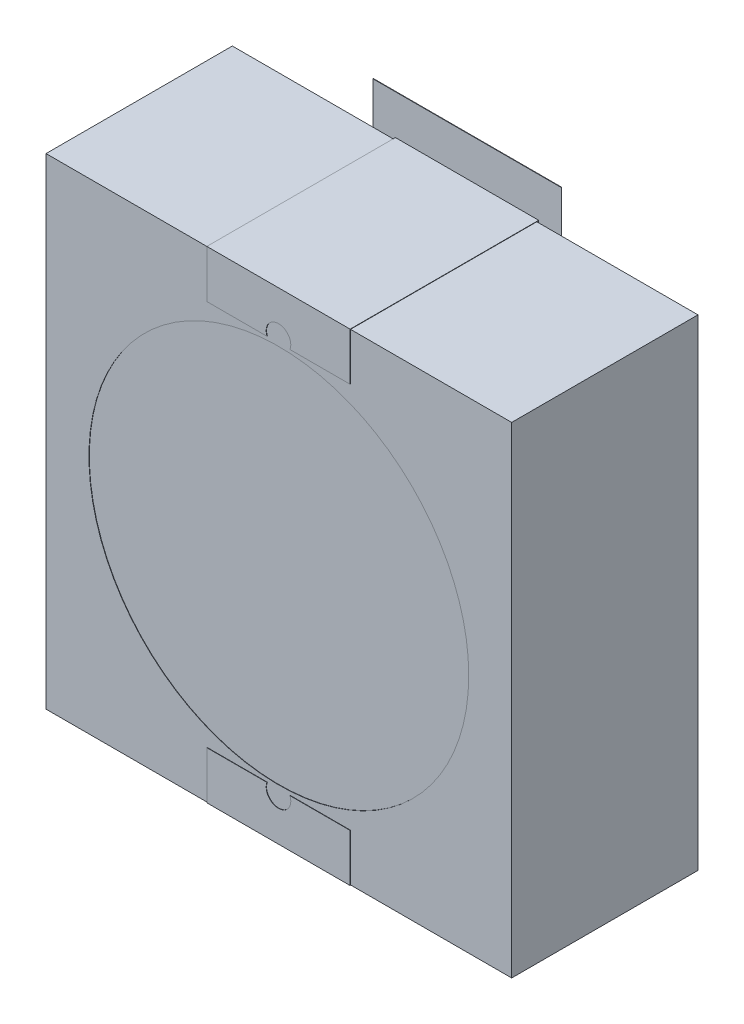
ISO-10303-21;
HEADER;
FILE_DESCRIPTION(('STEP AP214'),'2;1');
FILE_NAME('part.step','',(''),(''),'','','');
FILE_SCHEMA(('AUTOMOTIVE_DESIGN { 1 0 10303 214 1 1 1 1 }'));
ENDSEC;
DATA;
#1=APPLICATION_CONTEXT('core data for automotive mechanical design processes');
#2=APPLICATION_PROTOCOL_DEFINITION('international standard','automotive_design',2000,#1);
#3=PRODUCT_CONTEXT('',#1,'mechanical');
#4=PRODUCT('Part','Part','',(#3));
#5=PRODUCT_RELATED_PRODUCT_CATEGORY('part','',(#4));
#6=PRODUCT_DEFINITION_FORMATION('','',#4);
#7=PRODUCT_DEFINITION_CONTEXT('part definition',#1,'design');
#8=PRODUCT_DEFINITION('design','',#6,#7);
#9=PRODUCT_DEFINITION_SHAPE('','',#8);
#10=(LENGTH_UNIT() NAMED_UNIT(*) SI_UNIT(.MILLI.,.METRE.));
#11=(NAMED_UNIT(*) PLANE_ANGLE_UNIT() SI_UNIT($,.RADIAN.));
#12=(NAMED_UNIT(*) SI_UNIT($,.STERADIAN.) SOLID_ANGLE_UNIT());
#13=UNCERTAINTY_MEASURE_WITH_UNIT(LENGTH_MEASURE(1.E-05),#10,'distance_accuracy_value','');
#14=(GEOMETRIC_REPRESENTATION_CONTEXT(3) GLOBAL_UNCERTAINTY_ASSIGNED_CONTEXT((#13)) GLOBAL_UNIT_ASSIGNED_CONTEXT((#10,
#11,#12)) REPRESENTATION_CONTEXT('',''));
#15=CARTESIAN_POINT('',(0.,0.,0.));
#16=DIRECTION('',(0.,0.,1.));
#17=DIRECTION('',(1.,0.,0.));
#18=AXIS2_PLACEMENT_3D('',#15,#16,#17);
#19=CARTESIAN_POINT('',(-1.524,4.10972,0.0762));
#20=DIRECTION('',(0.,0.,-1.));
#21=DIRECTION('',(-1.,0.,0.));
#22=AXIS2_PLACEMENT_3D('',#19,#20,#21);
#23=PLANE('',#22);
#24=DIRECTION('',(1.,0.,0.));
#25=VECTOR('',#24,1.);
#26=CARTESIAN_POINT('',(2.0049998,-1.6500094,0.0762));
#27=LINE('',#26,#25);
#28=CARTESIAN_POINT('',(2.0049998,-1.6500094,0.0762));
#29=VERTEX_POINT('',#28);
#30=CARTESIAN_POINT('',(-2.0049998,-1.6500094,0.0762));
#31=VERTEX_POINT('',#30);
#32=EDGE_CURVE('E252',#29,#31,#27,.F.);
#33=ORIENTED_EDGE('',*,*,#32,.F.);
#34=DIRECTION('',(0.,1.,0.));
#35=VECTOR('',#34,1.);
#36=CARTESIAN_POINT('',(2.0049998,-5.9699906,0.0762));
#37=LINE('',#36,#35);
#38=CARTESIAN_POINT('',(2.0049998,-5.9699906,0.0762));
#39=VERTEX_POINT('',#38);
#40=EDGE_CURVE('E344',#39,#29,#37,.T.);
#41=ORIENTED_EDGE('',*,*,#40,.F.);
#42=DIRECTION('',(1.,0.,0.));
#43=VECTOR('',#42,1.);
#44=CARTESIAN_POINT('',(-2.0049998,-5.9699906,0.0762));
#45=LINE('',#44,#43);
#46=CARTESIAN_POINT('',(-2.0049998,-5.9699906,0.0762));
#47=VERTEX_POINT('',#46);
#48=EDGE_CURVE('E352',#47,#39,#45,.T.);
#49=ORIENTED_EDGE('',*,*,#48,.F.);
#50=DIRECTION('',(0.,1.,0.));
#51=VECTOR('',#50,1.);
#52=CARTESIAN_POINT('',(-2.0049998,-1.6500094,0.0762));
#53=LINE('',#52,#51);
#54=EDGE_CURVE('E357',#31,#47,#53,.F.);
#55=ORIENTED_EDGE('',*,*,#54,.F.);
#56=EDGE_LOOP('',(#33,#41,#49,#55));
#57=FACE_BOUND('',#56,.T.);
#58=ADVANCED_FACE('F16',(#57),#23,.T.);
#59=CARTESIAN_POINT('',(-1.524,4.10972,0.0762));
#60=DIRECTION('',(0.,0.,-1.));
#61=DIRECTION('',(-1.,0.,0.));
#62=AXIS2_PLACEMENT_3D('',#59,#60,#61);
#63=PLANE('',#62);
#64=DIRECTION('',(1.,0.,0.));
#65=VECTOR('',#64,1.);
#66=CARTESIAN_POINT('',(2.0049998,5.9699906,0.0762));
#67=LINE('',#66,#65);
#68=CARTESIAN_POINT('',(2.0049998,5.9699906,0.0762));
#69=VERTEX_POINT('',#68);
#70=CARTESIAN_POINT('',(-2.0049998,5.9699906,0.0762));
#71=VERTEX_POINT('',#70);
#72=EDGE_CURVE('E340',#69,#71,#67,.F.);
#73=ORIENTED_EDGE('',*,*,#72,.F.);
#74=DIRECTION('',(0.,1.,0.));
#75=VECTOR('',#74,1.);
#76=CARTESIAN_POINT('',(2.0049998,1.6500094,0.0762));
#77=LINE('',#76,#75);
#78=CARTESIAN_POINT('',(2.0049998,1.6500094,0.0762));
#79=VERTEX_POINT('',#78);
#80=EDGE_CURVE('E294',#79,#69,#77,.T.);
#81=ORIENTED_EDGE('',*,*,#80,.F.);
#82=DIRECTION('',(1.,0.,0.));
#83=VECTOR('',#82,1.);
#84=CARTESIAN_POINT('',(-2.0049998,1.6500094,0.0762));
#85=LINE('',#84,#83);
#86=CARTESIAN_POINT('',(-2.0049998,1.6500094,0.0762));
#87=VERTEX_POINT('',#86);
#88=EDGE_CURVE('E433',#87,#79,#85,.T.);
#89=ORIENTED_EDGE('',*,*,#88,.F.);
#90=DIRECTION('',(0.,1.,0.));
#91=VECTOR('',#90,1.);
#92=CARTESIAN_POINT('',(-2.0049998,5.9699906,0.0762));
#93=LINE('',#92,#91);
#94=EDGE_CURVE('E438',#71,#87,#93,.F.);
#95=ORIENTED_EDGE('',*,*,#94,.F.);
#96=EDGE_LOOP('',(#73,#81,#89,#95));
#97=FACE_BOUND('',#96,.T.);
#98=ADVANCED_FACE('F451',(#97),#63,.T.);
#99=CARTESIAN_POINT('',(-1.524,5.12572,4.09702));
#100=DIRECTION('',(0.,0.,1.));
#101=DIRECTION('',(1.,0.,0.));
#102=AXIS2_PLACEMENT_3D('',#99,#100,#101);
#103=PLANE('',#102);
#104=DIRECTION('',(1.,0.,0.));
#105=VECTOR('',#104,1.);
#106=CARTESIAN_POINT('',(-1.524,4.10972,4.09702));
#107=LINE('',#106,#105);
#108=CARTESIAN_POINT('',(-1.524,4.10972,4.09702));
#109=VERTEX_POINT('',#108);
#110=CARTESIAN_POINT('',(-0.244157293562977,4.10972,4.09702));
#111=VERTEX_POINT('',#110);
#112=EDGE_CURVE('E221',#109,#111,#107,.T.);
#113=ORIENTED_EDGE('',*,*,#112,.T.);
#114=CARTESIAN_POINT('',(0.,4.2037,4.09702));
#115=DIRECTION('',(0.,0.,1.));
#116=DIRECTION('',(1.,0.,0.));
#117=AXIS2_PLACEMENT_3D('',#114,#115,#116);
#118=CIRCLE('',#117,0.26162);
#119=CARTESIAN_POINT('',(0.244157293562981,4.10972,4.09702));
#120=VERTEX_POINT('',#119);
#121=EDGE_CURVE('E19',#111,#120,#118,.F.);
#122=ORIENTED_EDGE('',*,*,#121,.T.);
#123=DIRECTION('',(1.,0.,0.));
#124=VECTOR('',#123,1.);
#125=CARTESIAN_POINT('',(-1.524,4.10972,4.09702));
#126=LINE('',#125,#124);
#127=CARTESIAN_POINT('',(1.524,4.10972,4.09702));
#128=VERTEX_POINT('',#127);
#129=EDGE_CURVE('E264',#120,#128,#126,.T.);
#130=ORIENTED_EDGE('',*,*,#129,.T.);
#131=DIRECTION('',(0.,1.,0.));
#132=VECTOR('',#131,1.);
#133=CARTESIAN_POINT('',(1.524,5.12572,4.09702));
#134=LINE('',#133,#132);
#135=CARTESIAN_POINT('',(1.524,5.12572,4.09702));
#136=VERTEX_POINT('',#135);
#137=EDGE_CURVE('E266',#128,#136,#134,.T.);
#138=ORIENTED_EDGE('',*,*,#137,.T.);
#139=DIRECTION('',(1.,0.,0.));
#140=VECTOR('',#139,1.);
#141=CARTESIAN_POINT('',(-1.524,5.12572,4.09702));
#142=LINE('',#141,#140);
#143=CARTESIAN_POINT('',(-1.524,5.12572,4.09702));
#144=VERTEX_POINT('',#143);
#145=EDGE_CURVE('E291',#144,#136,#142,.T.);
#146=ORIENTED_EDGE('',*,*,#145,.F.);
#147=DIRECTION('',(0.,1.,0.));
#148=VECTOR('',#147,1.);
#149=CARTESIAN_POINT('',(-1.524,5.12572,4.09702));
#150=LINE('',#149,#148);
#151=EDGE_CURVE('E227',#144,#109,#150,.F.);
#152=ORIENTED_EDGE('',*,*,#151,.T.);
#153=EDGE_LOOP('',(#113,#122,#130,#138,#146,#152));
#154=FACE_BOUND('',#153,.T.);
#155=ADVANCED_FACE('F223',(#154),#103,.T.);
#156=CARTESIAN_POINT('',(0.,0.,4.08178));
#157=DIRECTION('',(0.,0.,1.));
#158=DIRECTION('',(1.,0.,0.));
#159=AXIS2_PLACEMENT_3D('',#156,#157,#158);
#160=PLANE('',#159);
#161=CARTESIAN_POINT('',(0.,0.,4.08178));
#162=DIRECTION('',(0.,0.,1.));
#163=DIRECTION('',(1.,0.,0.));
#164=AXIS2_PLACEMENT_3D('',#161,#162,#163);
#165=CIRCLE('',#164,4.0397019473008);
#166=CARTESIAN_POINT('',(4.0397019473008,0.,4.08178));
#167=VERTEX_POINT('',#166);
#168=EDGE_CURVE('E324',#167,#167,#165,.T.);
#169=ORIENTED_EDGE('',*,*,#168,.T.);
#170=EDGE_LOOP('',(#169));
#171=FACE_BOUND('',#170,.T.);
#172=ADVANCED_FACE('F733',(#171),#160,.T.);
#173=CARTESIAN_POINT('',(-1.524,-4.10972,4.09702));
#174=DIRECTION('',(0.,0.,1.));
#175=DIRECTION('',(1.,0.,0.));
#176=AXIS2_PLACEMENT_3D('',#173,#174,#175);
#177=PLANE('',#176);
#178=DIRECTION('',(1.,0.,0.));
#179=VECTOR('',#178,1.);
#180=CARTESIAN_POINT('',(-1.524,-4.10972,4.09702));
#181=LINE('',#180,#179);
#182=CARTESIAN_POINT('',(0.244157293562977,-4.10972,4.09702));
#183=VERTEX_POINT('',#182);
#184=CARTESIAN_POINT('',(1.524,-4.10972,4.09702));
#185=VERTEX_POINT('',#184);
#186=EDGE_CURVE('E329',#183,#185,#181,.T.);
#187=ORIENTED_EDGE('',*,*,#186,.F.);
#188=CARTESIAN_POINT('',(0.,-4.2037,4.09702));
#189=DIRECTION('',(0.,0.,1.));
#190=DIRECTION('',(1.,0.,0.));
#191=AXIS2_PLACEMENT_3D('',#188,#189,#190);
#192=CIRCLE('',#191,0.26162);
#193=CARTESIAN_POINT('',(-0.244157293562977,-4.10972,4.09702));
#194=VERTEX_POINT('',#193);
#195=EDGE_CURVE('E239',#183,#194,#192,.F.);
#196=ORIENTED_EDGE('',*,*,#195,.T.);
#197=DIRECTION('',(1.,0.,0.));
#198=VECTOR('',#197,1.);
#199=CARTESIAN_POINT('',(-1.524,-4.10972,4.09702));
#200=LINE('',#199,#198);
#201=CARTESIAN_POINT('',(-1.524,-4.10972,4.09702));
#202=VERTEX_POINT('',#201);
#203=EDGE_CURVE('E326',#202,#194,#200,.T.);
#204=ORIENTED_EDGE('',*,*,#203,.F.);
#205=DIRECTION('',(0.,1.,0.));
#206=VECTOR('',#205,1.);
#207=CARTESIAN_POINT('',(-1.524,-4.10972,4.09702));
#208=LINE('',#207,#206);
#209=CARTESIAN_POINT('',(-1.524,-5.12572,4.09702));
#210=VERTEX_POINT('',#209);
#211=EDGE_CURVE('E245',#202,#210,#208,.F.);
#212=ORIENTED_EDGE('',*,*,#211,.T.);
#213=DIRECTION('',(1.,0.,0.));
#214=VECTOR('',#213,1.);
#215=CARTESIAN_POINT('',(-1.524,-5.12572,4.09702));
#216=LINE('',#215,#214);
#217=CARTESIAN_POINT('',(1.524,-5.12572,4.09702));
#218=VERTEX_POINT('',#217);
#219=EDGE_CURVE('E269',#218,#210,#216,.F.);
#220=ORIENTED_EDGE('',*,*,#219,.F.);
#221=DIRECTION('',(0.,1.,0.));
#222=VECTOR('',#221,1.);
#223=CARTESIAN_POINT('',(1.524,-4.10972,4.09702));
#224=LINE('',#223,#222);
#225=EDGE_CURVE('E246',#218,#185,#224,.T.);
#226=ORIENTED_EDGE('',*,*,#225,.T.);
#227=EDGE_LOOP('',(#187,#196,#204,#212,#220,#226));
#228=FACE_BOUND('',#227,.T.);
#229=ADVANCED_FACE('F681',(#228),#177,.T.);
#230=CARTESIAN_POINT('',(2.0049998,-1.6500094,0.0762));
#231=DIRECTION('',(0.,1.,0.));
#232=DIRECTION('',(0.,0.,1.));
#233=AXIS2_PLACEMENT_3D('',#230,#231,#232);
#234=PLANE('',#233);
#235=DIRECTION('',(0.,0.,-1.));
#236=VECTOR('',#235,1.);
#237=CARTESIAN_POINT('',(2.0049998,-1.6500094,0.0762));
#238=LINE('',#237,#236);
#239=CARTESIAN_POINT('',(2.0049998,-1.6500094,0.08619999999996));
#240=VERTEX_POINT('',#239);
#241=EDGE_CURVE('E350',#29,#240,#238,.F.);
#242=ORIENTED_EDGE('',*,*,#241,.F.);
#243=ORIENTED_EDGE('',*,*,#32,.T.);
#244=DIRECTION('',(0.,0.,1.));
#245=VECTOR('',#244,1.);
#246=CARTESIAN_POINT('',(-2.0049998,-1.6500094,0.0762));
#247=LINE('',#246,#245);
#248=CARTESIAN_POINT('',(-2.0049998,-1.6500094,0.08619999999996));
#249=VERTEX_POINT('',#248);
#250=EDGE_CURVE('E359',#249,#31,#247,.F.);
#251=ORIENTED_EDGE('',*,*,#250,.F.);
#252=DIRECTION('',(1.,0.,0.));
#253=VECTOR('',#252,1.);
#254=CARTESIAN_POINT('',(0.,-1.6500094,0.08619999999996));
#255=LINE('',#254,#253);
#256=EDGE_CURVE('E271',#240,#249,#255,.F.);
#257=ORIENTED_EDGE('',*,*,#256,.F.);
#258=EDGE_LOOP('',(#242,#243,#251,#257));
#259=FACE_BOUND('',#258,.T.);
#260=ADVANCED_FACE('F726',(#259),#234,.T.);
#261=CARTESIAN_POINT('',(-2.0049998,-1.6500094,0.0762));
#262=DIRECTION('',(-1.,0.,0.));
#263=DIRECTION('',(0.,0.,1.));
#264=AXIS2_PLACEMENT_3D('',#261,#262,#263);
#265=PLANE('',#264);
#266=ORIENTED_EDGE('',*,*,#250,.T.);
#267=ORIENTED_EDGE('',*,*,#54,.T.);
#268=DIRECTION('',(0.,0.,-1.));
#269=VECTOR('',#268,1.);
#270=CARTESIAN_POINT('',(-2.0049998,-5.9699906,0.0762));
#271=LINE('',#270,#269);
#272=CARTESIAN_POINT('',(-2.0049998,-5.9699906,0.08619999999996));
#273=VERTEX_POINT('',#272);
#274=EDGE_CURVE('E354',#273,#47,#271,.T.);
#275=ORIENTED_EDGE('',*,*,#274,.F.);
#276=DIRECTION('',(0.,1.,0.));
#277=VECTOR('',#276,1.);
#278=CARTESIAN_POINT('',(-2.0049998,0.,0.08619999999996));
#279=LINE('',#278,#277);
#280=EDGE_CURVE('E485',#249,#273,#279,.F.);
#281=ORIENTED_EDGE('',*,*,#280,.F.);
#282=EDGE_LOOP('',(#266,#267,#275,#281));
#283=FACE_BOUND('',#282,.T.);
#284=ADVANCED_FACE('F722',(#283),#265,.T.);
#285=CARTESIAN_POINT('',(-2.0049998,-5.9699906,0.0762));
#286=DIRECTION('',(0.,-1.,0.));
#287=DIRECTION('',(0.,0.,-1.));
#288=AXIS2_PLACEMENT_3D('',#285,#286,#287);
#289=PLANE('',#288);
#290=ORIENTED_EDGE('',*,*,#274,.T.);
#291=ORIENTED_EDGE('',*,*,#48,.T.);
#292=DIRECTION('',(0.,0.,-1.));
#293=VECTOR('',#292,1.);
#294=CARTESIAN_POINT('',(2.0049998,-5.9699906,0.0762));
#295=LINE('',#294,#293);
#296=CARTESIAN_POINT('',(2.0049998,-5.9699906,0.08619999999996));
#297=VERTEX_POINT('',#296);
#298=EDGE_CURVE('E347',#297,#39,#295,.T.);
#299=ORIENTED_EDGE('',*,*,#298,.F.);
#300=DIRECTION('',(1.,0.,0.));
#301=VECTOR('',#300,1.);
#302=CARTESIAN_POINT('',(0.,-5.9699906,0.08619999999996));
#303=LINE('',#302,#301);
#304=EDGE_CURVE('E483',#273,#297,#303,.T.);
#305=ORIENTED_EDGE('',*,*,#304,.F.);
#306=EDGE_LOOP('',(#290,#291,#299,#305));
#307=FACE_BOUND('',#306,.T.);
#308=ADVANCED_FACE('F718',(#307),#289,.T.);
#309=CARTESIAN_POINT('',(2.0049998,-5.9699906,0.0762));
#310=DIRECTION('',(1.,0.,0.));
#311=DIRECTION('',(0.,0.,-1.));
#312=AXIS2_PLACEMENT_3D('',#309,#310,#311);
#313=PLANE('',#312);
#314=ORIENTED_EDGE('',*,*,#298,.T.);
#315=ORIENTED_EDGE('',*,*,#40,.T.);
#316=ORIENTED_EDGE('',*,*,#241,.T.);
#317=DIRECTION('',(0.,1.,0.));
#318=VECTOR('',#317,1.);
#319=CARTESIAN_POINT('',(2.0049998,0.,0.08619999999996));
#320=LINE('',#319,#318);
#321=EDGE_CURVE('E480',#297,#240,#320,.T.);
#322=ORIENTED_EDGE('',*,*,#321,.F.);
#323=EDGE_LOOP('',(#314,#315,#316,#322));
#324=FACE_BOUND('',#323,.T.);
#325=ADVANCED_FACE('F715',(#324),#313,.T.);
#326=CARTESIAN_POINT('',(2.0049998,5.9699906,0.0762));
#327=DIRECTION('',(0.,1.,0.));
#328=DIRECTION('',(0.,0.,1.));
#329=AXIS2_PLACEMENT_3D('',#326,#327,#328);
#330=PLANE('',#329);
#331=DIRECTION('',(0.,0.,-1.));
#332=VECTOR('',#331,1.);
#333=CARTESIAN_POINT('',(2.0049998,5.9699906,0.0762));
#334=LINE('',#333,#332);
#335=CARTESIAN_POINT('',(2.0049998,5.9699906,0.08619999999996));
#336=VERTEX_POINT('',#335);
#337=EDGE_CURVE('E431',#69,#336,#334,.F.);
#338=ORIENTED_EDGE('',*,*,#337,.F.);
#339=ORIENTED_EDGE('',*,*,#72,.T.);
#340=DIRECTION('',(0.,0.,1.));
#341=VECTOR('',#340,1.);
#342=CARTESIAN_POINT('',(-2.0049998,5.9699906,0.0762));
#343=LINE('',#342,#341);
#344=CARTESIAN_POINT('',(-2.0049998,5.9699906,0.08619999999996));
#345=VERTEX_POINT('',#344);
#346=EDGE_CURVE('E439',#345,#71,#343,.F.);
#347=ORIENTED_EDGE('',*,*,#346,.F.);
#348=DIRECTION('',(1.,0.,0.));
#349=VECTOR('',#348,1.);
#350=CARTESIAN_POINT('',(0.,5.9699906,0.08619999999996));
#351=LINE('',#350,#349);
#352=EDGE_CURVE('E467',#336,#345,#351,.F.);
#353=ORIENTED_EDGE('',*,*,#352,.F.);
#354=EDGE_LOOP('',(#338,#339,#347,#353));
#355=FACE_BOUND('',#354,.T.);
#356=ADVANCED_FACE('F447',(#355),#330,.T.);
#357=CARTESIAN_POINT('',(-2.0049998,5.9699906,0.0762));
#358=DIRECTION('',(-1.,0.,0.));
#359=DIRECTION('',(0.,0.,1.));
#360=AXIS2_PLACEMENT_3D('',#357,#358,#359);
#361=PLANE('',#360);
#362=ORIENTED_EDGE('',*,*,#346,.T.);
#363=ORIENTED_EDGE('',*,*,#94,.T.);
#364=DIRECTION('',(0.,0.,-1.));
#365=VECTOR('',#364,1.);
#366=CARTESIAN_POINT('',(-2.0049998,1.6500094,0.0762));
#367=LINE('',#366,#365);
#368=CARTESIAN_POINT('',(-2.0049998,1.6500094,0.08619999999996));
#369=VERTEX_POINT('',#368);
#370=EDGE_CURVE('E435',#369,#87,#367,.T.);
#371=ORIENTED_EDGE('',*,*,#370,.F.);
#372=DIRECTION('',(0.,1.,0.));
#373=VECTOR('',#372,1.);
#374=CARTESIAN_POINT('',(-2.0049998,0.,0.08619999999996));
#375=LINE('',#374,#373);
#376=EDGE_CURVE('E465',#345,#369,#375,.F.);
#377=ORIENTED_EDGE('',*,*,#376,.F.);
#378=EDGE_LOOP('',(#362,#363,#371,#377));
#379=FACE_BOUND('',#378,.T.);
#380=ADVANCED_FACE('F464',(#379),#361,.T.);
#381=CARTESIAN_POINT('',(-2.0049998,1.6500094,0.0762));
#382=DIRECTION('',(0.,-1.,0.));
#383=DIRECTION('',(0.,0.,-1.));
#384=AXIS2_PLACEMENT_3D('',#381,#382,#383);
#385=PLANE('',#384);
#386=ORIENTED_EDGE('',*,*,#370,.T.);
#387=ORIENTED_EDGE('',*,*,#88,.T.);
#388=DIRECTION('',(0.,0.,-1.));
#389=VECTOR('',#388,1.);
#390=CARTESIAN_POINT('',(2.0049998,1.6500094,0.0762));
#391=LINE('',#390,#389);
#392=CARTESIAN_POINT('',(2.0049998,1.6500094,0.08619999999996));
#393=VERTEX_POINT('',#392);
#394=EDGE_CURVE('E428',#393,#79,#391,.T.);
#395=ORIENTED_EDGE('',*,*,#394,.F.);
#396=DIRECTION('',(1.,0.,0.));
#397=VECTOR('',#396,1.);
#398=CARTESIAN_POINT('',(0.,1.6500094,0.08619999999996));
#399=LINE('',#398,#397);
#400=EDGE_CURVE('E462',#369,#393,#399,.T.);
#401=ORIENTED_EDGE('',*,*,#400,.F.);
#402=EDGE_LOOP('',(#386,#387,#395,#401));
#403=FACE_BOUND('',#402,.T.);
#404=ADVANCED_FACE('F461',(#403),#385,.T.);
#405=CARTESIAN_POINT('',(2.0049998,1.6500094,0.0762));
#406=DIRECTION('',(1.,0.,0.));
#407=DIRECTION('',(0.,0.,-1.));
#408=AXIS2_PLACEMENT_3D('',#405,#406,#407);
#409=PLANE('',#408);
#410=ORIENTED_EDGE('',*,*,#394,.T.);
#411=ORIENTED_EDGE('',*,*,#80,.T.);
#412=ORIENTED_EDGE('',*,*,#337,.T.);
#413=DIRECTION('',(0.,1.,0.));
#414=VECTOR('',#413,1.);
#415=CARTESIAN_POINT('',(2.0049998,0.,0.08619999999996));
#416=LINE('',#415,#414);
#417=EDGE_CURVE('E458',#393,#336,#416,.T.);
#418=ORIENTED_EDGE('',*,*,#417,.F.);
#419=EDGE_LOOP('',(#410,#411,#412,#418));
#420=FACE_BOUND('',#419,.T.);
#421=ADVANCED_FACE('F454',(#420),#409,.T.);
#422=CARTESIAN_POINT('',(-1.524,5.12572,0.0762));
#423=DIRECTION('',(0.,1.,0.));
#424=DIRECTION('',(0.,0.,1.));
#425=AXIS2_PLACEMENT_3D('',#422,#423,#424);
#426=PLANE('',#425);
#427=DIRECTION('',(0.,0.,-1.));
#428=VECTOR('',#427,1.);
#429=CARTESIAN_POINT('',(1.524,5.12572,0.0762));
#430=LINE('',#429,#428);
#431=CARTESIAN_POINT('',(1.524,5.12572,0.08619999999996));
#432=VERTEX_POINT('',#431);
#433=EDGE_CURVE('E307',#432,#136,#430,.F.);
#434=ORIENTED_EDGE('',*,*,#433,.F.);
#435=DIRECTION('',(1.,0.,0.));
#436=VECTOR('',#435,1.);
#437=CARTESIAN_POINT('',(0.,5.12572,0.08619999999996));
#438=LINE('',#437,#436);
#439=CARTESIAN_POINT('',(-1.524,5.12572,0.08619999999996));
#440=VERTEX_POINT('',#439);
#441=EDGE_CURVE('E505',#440,#432,#438,.T.);
#442=ORIENTED_EDGE('',*,*,#441,.F.);
#443=DIRECTION('',(0.,0.,-1.));
#444=VECTOR('',#443,1.);
#445=CARTESIAN_POINT('',(-1.524,5.12572,0.0762));
#446=LINE('',#445,#444);
#447=EDGE_CURVE('E297',#440,#144,#446,.F.);
#448=ORIENTED_EDGE('',*,*,#447,.T.);
#449=ORIENTED_EDGE('',*,*,#145,.T.);
#450=EDGE_LOOP('',(#434,#442,#448,#449));
#451=FACE_BOUND('',#450,.T.);
#452=ADVANCED_FACE('F596',(#451),#426,.T.);
#453=CARTESIAN_POINT('',(-1.524,4.10972,4.09702));
#454=DIRECTION('',(0.,-1.,0.));
#455=DIRECTION('',(0.,0.,-1.));
#456=AXIS2_PLACEMENT_3D('',#453,#454,#455);
#457=PLANE('',#456);
#458=ORIENTED_EDGE('',*,*,#129,.F.);
#459=DIRECTION('',(0.,0.,1.));
#460=VECTOR('',#459,1.);
#461=CARTESIAN_POINT('',(0.24415729356298,4.10972,4.0894));
#462=LINE('',#461,#460);
#463=CARTESIAN_POINT('',(0.244157293562981,4.10972,4.0894));
#464=VERTEX_POINT('',#463);
#465=EDGE_CURVE('E240',#120,#464,#462,.F.);
#466=ORIENTED_EDGE('',*,*,#465,.T.);
#467=DIRECTION('',(1.,0.,0.));
#468=VECTOR('',#467,1.);
#469=CARTESIAN_POINT('',(0.,4.10972,4.0894));
#470=LINE('',#469,#468);
#471=CARTESIAN_POINT('',(1.524,4.10972,4.0894));
#472=VERTEX_POINT('',#471);
#473=EDGE_CURVE('E323',#472,#464,#470,.F.);
#474=ORIENTED_EDGE('',*,*,#473,.F.);
#475=DIRECTION('',(0.,0.,-1.));
#476=VECTOR('',#475,1.);
#477=CARTESIAN_POINT('',(1.524,4.10972,0.0762));
#478=LINE('',#477,#476);
#479=EDGE_CURVE('E310',#128,#472,#478,.T.);
#480=ORIENTED_EDGE('',*,*,#479,.F.);
#481=EDGE_LOOP('',(#458,#466,#474,#480));
#482=FACE_BOUND('',#481,.T.);
#483=ADVANCED_FACE('F592',(#482),#457,.T.);
#484=CARTESIAN_POINT('',(0.,4.2037,4.0894));
#485=DIRECTION('',(0.,0.,1.));
#486=DIRECTION('',(1.,0.,0.));
#487=AXIS2_PLACEMENT_3D('',#484,#485,#486);
#488=CYLINDRICAL_SURFACE('',#487,0.26162);
#489=CARTESIAN_POINT('',(0.,4.2037,4.0894));
#490=DIRECTION('',(0.,0.,1.));
#491=DIRECTION('',(1.,0.,0.));
#492=AXIS2_PLACEMENT_3D('',#489,#490,#491);
#493=CIRCLE('',#492,0.26162);
#494=CARTESIAN_POINT('',(-0.244157293562977,4.10972,4.0894));
#495=VERTEX_POINT('',#494);
#496=EDGE_CURVE('E321',#464,#495,#493,.T.);
#497=ORIENTED_EDGE('',*,*,#496,.F.);
#498=ORIENTED_EDGE('',*,*,#465,.F.);
#499=ORIENTED_EDGE('',*,*,#121,.F.);
#500=DIRECTION('',(0.,0.,-1.));
#501=VECTOR('',#500,1.);
#502=CARTESIAN_POINT('',(-0.244157293562973,4.10972,4.09702));
#503=LINE('',#502,#501);
#504=EDGE_CURVE('E234',#495,#111,#503,.F.);
#505=ORIENTED_EDGE('',*,*,#504,.F.);
#506=EDGE_LOOP('',(#497,#498,#499,#505));
#507=FACE_BOUND('',#506,.T.);
#508=ADVANCED_FACE('F242',(#507),#488,.F.);
#509=CARTESIAN_POINT('',(-1.524,4.10972,4.09702));
#510=DIRECTION('',(0.,-1.,0.));
#511=DIRECTION('',(0.,0.,-1.));
#512=AXIS2_PLACEMENT_3D('',#509,#510,#511);
#513=PLANE('',#512);
#514=DIRECTION('',(1.,0.,0.));
#515=VECTOR('',#514,1.);
#516=CARTESIAN_POINT('',(0.,4.10972,4.0894));
#517=LINE('',#516,#515);
#518=CARTESIAN_POINT('',(-1.524,4.10972,4.0894));
#519=VERTEX_POINT('',#518);
#520=EDGE_CURVE('E236',#495,#519,#517,.F.);
#521=ORIENTED_EDGE('',*,*,#520,.F.);
#522=ORIENTED_EDGE('',*,*,#504,.T.);
#523=ORIENTED_EDGE('',*,*,#112,.F.);
#524=DIRECTION('',(0.,0.,-1.));
#525=VECTOR('',#524,1.);
#526=CARTESIAN_POINT('',(-1.524,4.10972,0.0762));
#527=LINE('',#526,#525);
#528=EDGE_CURVE('E300',#109,#519,#527,.T.);
#529=ORIENTED_EDGE('',*,*,#528,.T.);
#530=EDGE_LOOP('',(#521,#522,#523,#529));
#531=FACE_BOUND('',#530,.T.);
#532=ADVANCED_FACE('F235',(#531),#513,.T.);
#533=CARTESIAN_POINT('',(0.,-4.2037,4.0894));
#534=DIRECTION('',(0.,0.,1.));
#535=DIRECTION('',(1.,0.,0.));
#536=AXIS2_PLACEMENT_3D('',#533,#534,#535);
#537=CYLINDRICAL_SURFACE('',#536,0.26162);
#538=CARTESIAN_POINT('',(0.,-4.2037,4.0894));
#539=DIRECTION('',(0.,0.,1.));
#540=DIRECTION('',(1.,0.,0.));
#541=AXIS2_PLACEMENT_3D('',#538,#539,#540);
#542=CIRCLE('',#541,0.26162);
#543=CARTESIAN_POINT('',(-0.244157293562977,-4.10972,4.0894));
#544=VERTEX_POINT('',#543);
#545=CARTESIAN_POINT('',(0.244157293562977,-4.10972,4.0894));
#546=VERTEX_POINT('',#545);
#547=EDGE_CURVE('E318',#544,#546,#542,.T.);
#548=ORIENTED_EDGE('',*,*,#547,.F.);
#549=DIRECTION('',(0.,0.,1.));
#550=VECTOR('',#549,1.);
#551=CARTESIAN_POINT('',(-0.244157293562973,-4.10972,0.0762));
#552=LINE('',#551,#550);
#553=EDGE_CURVE('E272',#194,#544,#552,.F.);
#554=ORIENTED_EDGE('',*,*,#553,.F.);
#555=ORIENTED_EDGE('',*,*,#195,.F.);
#556=DIRECTION('',(0.,0.,1.));
#557=VECTOR('',#556,1.);
#558=CARTESIAN_POINT('',(0.244157293562973,-4.10972,0.0762));
#559=LINE('',#558,#557);
#560=EDGE_CURVE('E327',#546,#183,#559,.T.);
#561=ORIENTED_EDGE('',*,*,#560,.F.);
#562=EDGE_LOOP('',(#548,#554,#555,#561));
#563=FACE_BOUND('',#562,.T.);
#564=ADVANCED_FACE('F575',(#563),#537,.F.);
#565=CARTESIAN_POINT('',(-1.524,-4.10972,0.0762));
#566=DIRECTION('',(0.,1.,0.));
#567=DIRECTION('',(0.,0.,1.));
#568=AXIS2_PLACEMENT_3D('',#565,#566,#567);
#569=PLANE('',#568);
#570=DIRECTION('',(1.,0.,0.));
#571=VECTOR('',#570,1.);
#572=CARTESIAN_POINT('',(0.,-4.10972,4.0894));
#573=LINE('',#572,#571);
#574=CARTESIAN_POINT('',(1.524,-4.10972,4.0894));
#575=VERTEX_POINT('',#574);
#576=EDGE_CURVE('E317',#546,#575,#573,.T.);
#577=ORIENTED_EDGE('',*,*,#576,.F.);
#578=ORIENTED_EDGE('',*,*,#560,.T.);
#579=ORIENTED_EDGE('',*,*,#186,.T.);
#580=DIRECTION('',(0.,0.,-1.));
#581=VECTOR('',#580,1.);
#582=CARTESIAN_POINT('',(1.524,-4.10972,0.0762));
#583=LINE('',#582,#581);
#584=EDGE_CURVE('E278',#575,#185,#583,.F.);
#585=ORIENTED_EDGE('',*,*,#584,.F.);
#586=EDGE_LOOP('',(#577,#578,#579,#585));
#587=FACE_BOUND('',#586,.T.);
#588=ADVANCED_FACE('F576',(#587),#569,.T.);
#589=CARTESIAN_POINT('',(0.,0.,4.0894));
#590=DIRECTION('',(0.,0.,1.));
#591=DIRECTION('',(1.,0.,0.));
#592=AXIS2_PLACEMENT_3D('',#589,#590,#591);
#593=CYLINDRICAL_SURFACE('',#592,4.0397019473008);
#594=ORIENTED_EDGE('',*,*,#168,.F.);
#595=EDGE_LOOP('',(#594));
#596=FACE_BOUND('',#595,.T.);
#597=CARTESIAN_POINT('',(0.,0.,4.0894));
#598=DIRECTION('',(0.,0.,1.));
#599=DIRECTION('',(1.,0.,0.));
#600=AXIS2_PLACEMENT_3D('',#597,#598,#599);
#601=CIRCLE('',#600,4.0397019473008);
#602=CARTESIAN_POINT('',(4.0397019473008,0.,4.0894));
#603=VERTEX_POINT('',#602);
#604=EDGE_CURVE('E313',#603,#603,#601,.F.);
#605=ORIENTED_EDGE('',*,*,#604,.F.);
#606=EDGE_LOOP('',(#605));
#607=FACE_BOUND('',#606,.T.);
#608=ADVANCED_FACE('F684',(#596,#607),#593,.F.);
#609=CARTESIAN_POINT('',(-1.524,-4.10972,0.0762));
#610=DIRECTION('',(0.,1.,0.));
#611=DIRECTION('',(0.,0.,1.));
#612=AXIS2_PLACEMENT_3D('',#609,#610,#611);
#613=PLANE('',#612);
#614=ORIENTED_EDGE('',*,*,#203,.T.);
#615=ORIENTED_EDGE('',*,*,#553,.T.);
#616=DIRECTION('',(1.,0.,0.));
#617=VECTOR('',#616,1.);
#618=CARTESIAN_POINT('',(0.,-4.10972,4.0894));
#619=LINE('',#618,#617);
#620=CARTESIAN_POINT('',(-1.524,-4.10972,4.0894));
#621=VERTEX_POINT('',#620);
#622=EDGE_CURVE('E320',#621,#544,#619,.T.);
#623=ORIENTED_EDGE('',*,*,#622,.F.);
#624=DIRECTION('',(0.,0.,-1.));
#625=VECTOR('',#624,1.);
#626=CARTESIAN_POINT('',(-1.524,-4.10972,0.0762));
#627=LINE('',#626,#625);
#628=EDGE_CURVE('E285',#621,#202,#627,.F.);
#629=ORIENTED_EDGE('',*,*,#628,.T.);
#630=EDGE_LOOP('',(#614,#615,#623,#629));
#631=FACE_BOUND('',#630,.T.);
#632=ADVANCED_FACE('F682',(#631),#613,.T.);
#633=CARTESIAN_POINT('',(-1.524,-5.12572,4.09702));
#634=DIRECTION('',(0.,-1.,0.));
#635=DIRECTION('',(0.,0.,-1.));
#636=AXIS2_PLACEMENT_3D('',#633,#634,#635);
#637=PLANE('',#636);
#638=DIRECTION('',(0.,0.,-1.));
#639=VECTOR('',#638,1.);
#640=CARTESIAN_POINT('',(-1.524,-5.12572,0.0762));
#641=LINE('',#640,#639);
#642=CARTESIAN_POINT('',(-1.524,-5.12572,0.08619999999996));
#643=VERTEX_POINT('',#642);
#644=EDGE_CURVE('E281',#210,#643,#641,.T.);
#645=ORIENTED_EDGE('',*,*,#644,.T.);
#646=DIRECTION('',(1.,0.,0.));
#647=VECTOR('',#646,1.);
#648=CARTESIAN_POINT('',(0.,-5.12572,0.08619999999996));
#649=LINE('',#648,#647);
#650=CARTESIAN_POINT('',(1.524,-5.12572,0.08619999999996));
#651=VERTEX_POINT('',#650);
#652=EDGE_CURVE('E478',#651,#643,#649,.F.);
#653=ORIENTED_EDGE('',*,*,#652,.F.);
#654=DIRECTION('',(0.,0.,-1.));
#655=VECTOR('',#654,1.);
#656=CARTESIAN_POINT('',(1.524,-5.12572,0.0762));
#657=LINE('',#656,#655);
#658=EDGE_CURVE('E275',#218,#651,#657,.T.);
#659=ORIENTED_EDGE('',*,*,#658,.F.);
#660=ORIENTED_EDGE('',*,*,#219,.T.);
#661=EDGE_LOOP('',(#645,#653,#659,#660));
#662=FACE_BOUND('',#661,.T.);
#663=ADVANCED_FACE('F680',(#662),#637,.T.);
#664=CARTESIAN_POINT('',(0.,0.,0.08619999999996));
#665=DIRECTION('',(0.,0.,1.));
#666=DIRECTION('',(1.,0.,0.));
#667=AXIS2_PLACEMENT_3D('',#664,#665,#666);
#668=PLANE('',#667);
#669=ORIENTED_EDGE('',*,*,#652,.T.);
#670=DIRECTION('',(0.,1.,0.));
#671=VECTOR('',#670,1.);
#672=CARTESIAN_POINT('',(-1.524,0.,0.08619999999996));
#673=LINE('',#672,#671);
#674=CARTESIAN_POINT('',(-1.524,-4.10972,0.08619999999996));
#675=VERTEX_POINT('',#674);
#676=EDGE_CURVE('E316',#643,#675,#673,.T.);
#677=ORIENTED_EDGE('',*,*,#676,.T.);
#678=DIRECTION('',(1.,0.,0.));
#679=VECTOR('',#678,1.);
#680=CARTESIAN_POINT('',(-1.524,-4.10972,0.08619999999996));
#681=LINE('',#680,#679);
#682=CARTESIAN_POINT('',(1.524,-4.10972,0.08619999999996));
#683=VERTEX_POINT('',#682);
#684=EDGE_CURVE('E418',#683,#675,#681,.F.);
#685=ORIENTED_EDGE('',*,*,#684,.F.);
#686=DIRECTION('',(0.,1.,0.));
#687=VECTOR('',#686,1.);
#688=CARTESIAN_POINT('',(1.524,0.,0.08619999999996));
#689=LINE('',#688,#687);
#690=EDGE_CURVE('E277',#651,#683,#689,.T.);
#691=ORIENTED_EDGE('',*,*,#690,.F.);
#692=EDGE_LOOP('',(#669,#677,#685,#691));
#693=FACE_BOUND('',#692,.T.);
#694=ORIENTED_EDGE('',*,*,#304,.T.);
#695=ORIENTED_EDGE('',*,*,#321,.T.);
#696=ORIENTED_EDGE('',*,*,#256,.T.);
#697=ORIENTED_EDGE('',*,*,#280,.T.);
#698=EDGE_LOOP('',(#694,#695,#696,#697));
#699=FACE_BOUND('',#698,.T.);
#700=ADVANCED_FACE('F626',(#693,#699),#668,.T.);
#701=CARTESIAN_POINT('',(1.524,0.,0.0762));
#702=DIRECTION('',(1.,0.,0.));
#703=DIRECTION('',(0.,0.,-1.));
#704=AXIS2_PLACEMENT_3D('',#701,#702,#703);
#705=PLANE('',#704);
#706=ORIENTED_EDGE('',*,*,#658,.T.);
#707=ORIENTED_EDGE('',*,*,#690,.T.);
#708=DIRECTION('',(0.,0.,1.));
#709=VECTOR('',#708,1.);
#710=CARTESIAN_POINT('',(1.524,-4.10972,0.0762));
#711=LINE('',#710,#709);
#712=CARTESIAN_POINT('',(1.524,-4.10972,0.126200000000003));
#713=VERTEX_POINT('',#712);
#714=EDGE_CURVE('E617',#713,#683,#711,.F.);
#715=ORIENTED_EDGE('',*,*,#714,.F.);
#716=DIRECTION('',(0.,1.,0.));
#717=VECTOR('',#716,1.);
#718=CARTESIAN_POINT('',(1.524,0.,0.126200000000003));
#719=LINE('',#718,#717);
#720=CARTESIAN_POINT('',(1.524,-5.1181,0.126200000000003));
#721=VERTEX_POINT('',#720);
#722=EDGE_CURVE('E411',#713,#721,#719,.F.);
#723=ORIENTED_EDGE('',*,*,#722,.T.);
#724=DIRECTION('',(0.,0.,-1.));
#725=VECTOR('',#724,1.);
#726=CARTESIAN_POINT('',(1.524,-5.1181,0.0762));
#727=LINE('',#726,#725);
#728=CARTESIAN_POINT('',(1.524,-5.1181,4.0894));
#729=VERTEX_POINT('',#728);
#730=EDGE_CURVE('E417',#729,#721,#727,.T.);
#731=ORIENTED_EDGE('',*,*,#730,.F.);
#732=DIRECTION('',(0.,1.,0.));
#733=VECTOR('',#732,1.);
#734=CARTESIAN_POINT('',(1.524,0.,4.0894));
#735=LINE('',#734,#733);
#736=EDGE_CURVE('E391',#575,#729,#735,.F.);
#737=ORIENTED_EDGE('',*,*,#736,.F.);
#738=ORIENTED_EDGE('',*,*,#584,.T.);
#739=ORIENTED_EDGE('',*,*,#225,.F.);
#740=EDGE_LOOP('',(#706,#707,#715,#723,#731,#737,#738,#739));
#741=FACE_BOUND('',#740,.T.);
#742=ADVANCED_FACE('F520',(#741),#705,.T.);
#743=CARTESIAN_POINT('',(1.524,0.,0.0762));
#744=DIRECTION('',(1.,0.,0.));
#745=DIRECTION('',(0.,0.,-1.));
#746=AXIS2_PLACEMENT_3D('',#743,#744,#745);
#747=PLANE('',#746);
#748=DIRECTION('',(0.,0.,-1.));
#749=VECTOR('',#748,1.);
#750=CARTESIAN_POINT('',(1.524,4.10972,0.0762));
#751=LINE('',#750,#749);
#752=CARTESIAN_POINT('',(1.524,4.10972,0.126200000000003));
#753=VERTEX_POINT('',#752);
#754=CARTESIAN_POINT('',(1.524,4.10972,0.08619999999996));
#755=VERTEX_POINT('',#754);
#756=EDGE_CURVE('E470',#753,#755,#751,.T.);
#757=ORIENTED_EDGE('',*,*,#756,.T.);
#758=DIRECTION('',(0.,1.,0.));
#759=VECTOR('',#758,1.);
#760=CARTESIAN_POINT('',(1.524,0.,0.08619999999996));
#761=LINE('',#760,#759);
#762=EDGE_CURVE('E502',#432,#755,#761,.F.);
#763=ORIENTED_EDGE('',*,*,#762,.F.);
#764=ORIENTED_EDGE('',*,*,#433,.T.);
#765=ORIENTED_EDGE('',*,*,#137,.F.);
#766=ORIENTED_EDGE('',*,*,#479,.T.);
#767=DIRECTION('',(0.,1.,0.));
#768=VECTOR('',#767,1.);
#769=CARTESIAN_POINT('',(1.524,0.,4.0894));
#770=LINE('',#769,#768);
#771=CARTESIAN_POINT('',(1.524,5.1181,4.0894));
#772=VERTEX_POINT('',#771);
#773=EDGE_CURVE('E388',#772,#472,#770,.F.);
#774=ORIENTED_EDGE('',*,*,#773,.F.);
#775=DIRECTION('',(0.,0.,1.));
#776=VECTOR('',#775,1.);
#777=CARTESIAN_POINT('',(1.524,5.1181,0.0762));
#778=LINE('',#777,#776);
#779=CARTESIAN_POINT('',(1.524,5.1181,0.126200000000003));
#780=VERTEX_POINT('',#779);
#781=EDGE_CURVE('E398',#780,#772,#778,.T.);
#782=ORIENTED_EDGE('',*,*,#781,.F.);
#783=DIRECTION('',(0.,1.,0.));
#784=VECTOR('',#783,1.);
#785=CARTESIAN_POINT('',(1.524,0.,0.126200000000003));
#786=LINE('',#785,#784);
#787=EDGE_CURVE('E395',#780,#753,#786,.F.);
#788=ORIENTED_EDGE('',*,*,#787,.T.);
#789=EDGE_LOOP('',(#757,#763,#764,#765,#766,#774,#782,#788));
#790=FACE_BOUND('',#789,.T.);
#791=ADVANCED_FACE('F509',(#790),#747,.T.);
#792=CARTESIAN_POINT('',(0.,0.,0.08619999999996));
#793=DIRECTION('',(0.,0.,1.));
#794=DIRECTION('',(1.,0.,0.));
#795=AXIS2_PLACEMENT_3D('',#792,#793,#794);
#796=PLANE('',#795);
#797=DIRECTION('',(1.,0.,0.));
#798=VECTOR('',#797,1.);
#799=CARTESIAN_POINT('',(-1.524,4.10972,0.0861999999999599));
#800=LINE('',#799,#798);
#801=CARTESIAN_POINT('',(-1.524,4.10972,0.08619999999996));
#802=VERTEX_POINT('',#801);
#803=EDGE_CURVE('E601',#802,#755,#800,.T.);
#804=ORIENTED_EDGE('',*,*,#803,.F.);
#805=DIRECTION('',(0.,1.,0.));
#806=VECTOR('',#805,1.);
#807=CARTESIAN_POINT('',(-1.524,0.,0.08619999999996));
#808=LINE('',#807,#806);
#809=EDGE_CURVE('E301',#802,#440,#808,.T.);
#810=ORIENTED_EDGE('',*,*,#809,.T.);
#811=ORIENTED_EDGE('',*,*,#441,.T.);
#812=ORIENTED_EDGE('',*,*,#762,.T.);
#813=EDGE_LOOP('',(#804,#810,#811,#812));
#814=FACE_BOUND('',#813,.T.);
#815=ORIENTED_EDGE('',*,*,#400,.T.);
#816=ORIENTED_EDGE('',*,*,#417,.T.);
#817=ORIENTED_EDGE('',*,*,#352,.T.);
#818=ORIENTED_EDGE('',*,*,#376,.T.);
#819=EDGE_LOOP('',(#815,#816,#817,#818));
#820=FACE_BOUND('',#819,.T.);
#821=ADVANCED_FACE('F506',(#814,#820),#796,.T.);
#822=CARTESIAN_POINT('',(-1.524,0.,0.0762));
#823=DIRECTION('',(1.,0.,0.));
#824=DIRECTION('',(0.,0.,-1.));
#825=AXIS2_PLACEMENT_3D('',#822,#823,#824);
#826=PLANE('',#825);
#827=DIRECTION('',(0.,1.,0.));
#828=VECTOR('',#827,1.);
#829=CARTESIAN_POINT('',(-1.524,0.,0.126200000000003));
#830=LINE('',#829,#828);
#831=CARTESIAN_POINT('',(-1.524,5.1181,0.126200000000003));
#832=VERTEX_POINT('',#831);
#833=CARTESIAN_POINT('',(-1.524,4.10972,0.126200000000003));
#834=VERTEX_POINT('',#833);
#835=EDGE_CURVE('E380',#832,#834,#830,.F.);
#836=ORIENTED_EDGE('',*,*,#835,.F.);
#837=DIRECTION('',(0.,0.,1.));
#838=VECTOR('',#837,1.);
#839=CARTESIAN_POINT('',(-1.524,5.1181,0.0762));
#840=LINE('',#839,#838);
#841=CARTESIAN_POINT('',(-1.524,5.1181,4.0894));
#842=VERTEX_POINT('',#841);
#843=EDGE_CURVE('E607',#842,#832,#840,.F.);
#844=ORIENTED_EDGE('',*,*,#843,.F.);
#845=DIRECTION('',(0.,1.,0.));
#846=VECTOR('',#845,1.);
#847=CARTESIAN_POINT('',(-1.524,0.,4.0894));
#848=LINE('',#847,#846);
#849=EDGE_CURVE('E383',#519,#842,#848,.T.);
#850=ORIENTED_EDGE('',*,*,#849,.F.);
#851=ORIENTED_EDGE('',*,*,#528,.F.);
#852=ORIENTED_EDGE('',*,*,#151,.F.);
#853=ORIENTED_EDGE('',*,*,#447,.F.);
#854=ORIENTED_EDGE('',*,*,#809,.F.);
#855=DIRECTION('',(0.,0.,-1.));
#856=VECTOR('',#855,1.);
#857=CARTESIAN_POINT('',(-1.524,4.10972,4.09702));
#858=LINE('',#857,#856);
#859=EDGE_CURVE('E401',#834,#802,#858,.T.);
#860=ORIENTED_EDGE('',*,*,#859,.F.);
#861=EDGE_LOOP('',(#836,#844,#850,#851,#852,#853,#854,#860));
#862=FACE_BOUND('',#861,.T.);
#863=ADVANCED_FACE('F508',(#862),#826,.F.);
#864=CARTESIAN_POINT('',(0.,0.,4.0894));
#865=DIRECTION('',(0.,0.,1.));
#866=DIRECTION('',(1.,0.,0.));
#867=AXIS2_PLACEMENT_3D('',#864,#865,#866);
#868=PLANE('',#867);
#869=ORIENTED_EDGE('',*,*,#604,.T.);
#870=EDGE_LOOP('',(#869));
#871=FACE_BOUND('',#870,.T.);
#872=ORIENTED_EDGE('',*,*,#547,.T.);
#873=ORIENTED_EDGE('',*,*,#576,.T.);
#874=ORIENTED_EDGE('',*,*,#736,.T.);
#875=DIRECTION('',(1.,0.,0.));
#876=VECTOR('',#875,1.);
#877=CARTESIAN_POINT('',(-4.953,-5.1181,4.0894));
#878=LINE('',#877,#876);
#879=CARTESIAN_POINT('',(4.953,-5.1181,4.0894));
#880=VERTEX_POINT('',#879);
#881=EDGE_CURVE('E414',#880,#729,#878,.F.);
#882=ORIENTED_EDGE('',*,*,#881,.F.);
#883=DIRECTION('',(0.,1.,0.));
#884=VECTOR('',#883,1.);
#885=CARTESIAN_POINT('',(4.953,-5.1181,4.0894));
#886=LINE('',#885,#884);
#887=CARTESIAN_POINT('',(4.953,5.1181,4.0894));
#888=VERTEX_POINT('',#887);
#889=EDGE_CURVE('E423',#888,#880,#886,.F.);
#890=ORIENTED_EDGE('',*,*,#889,.F.);
#891=DIRECTION('',(1.,0.,0.));
#892=VECTOR('',#891,1.);
#893=CARTESIAN_POINT('',(4.953,5.1181,4.0894));
#894=LINE('',#893,#892);
#895=EDGE_CURVE('E405',#772,#888,#894,.T.);
#896=ORIENTED_EDGE('',*,*,#895,.F.);
#897=ORIENTED_EDGE('',*,*,#773,.T.);
#898=ORIENTED_EDGE('',*,*,#473,.T.);
#899=ORIENTED_EDGE('',*,*,#496,.T.);
#900=ORIENTED_EDGE('',*,*,#520,.T.);
#901=ORIENTED_EDGE('',*,*,#849,.T.);
#902=DIRECTION('',(1.,0.,0.));
#903=VECTOR('',#902,1.);
#904=CARTESIAN_POINT('',(4.953,5.1181,4.0894));
#905=LINE('',#904,#903);
#906=CARTESIAN_POINT('',(-4.953,5.1181,4.0894));
#907=VERTEX_POINT('',#906);
#908=EDGE_CURVE('E604',#907,#842,#905,.T.);
#909=ORIENTED_EDGE('',*,*,#908,.F.);
#910=DIRECTION('',(0.,1.,0.));
#911=VECTOR('',#910,1.);
#912=CARTESIAN_POINT('',(-4.953,5.1181,4.0894));
#913=LINE('',#912,#911);
#914=CARTESIAN_POINT('',(-4.953,-5.1181,4.0894));
#915=VERTEX_POINT('',#914);
#916=EDGE_CURVE('E664',#915,#907,#913,.T.);
#917=ORIENTED_EDGE('',*,*,#916,.F.);
#918=DIRECTION('',(1.,0.,0.));
#919=VECTOR('',#918,1.);
#920=CARTESIAN_POINT('',(-4.953,-5.1181,4.0894));
#921=LINE('',#920,#919);
#922=CARTESIAN_POINT('',(-1.524,-5.1181,4.0894));
#923=VERTEX_POINT('',#922);
#924=EDGE_CURVE('E661',#923,#915,#921,.F.);
#925=ORIENTED_EDGE('',*,*,#924,.F.);
#926=DIRECTION('',(0.,1.,0.));
#927=VECTOR('',#926,1.);
#928=CARTESIAN_POINT('',(-1.524,0.,4.0894));
#929=LINE('',#928,#927);
#930=EDGE_CURVE('E371',#923,#621,#929,.T.);
#931=ORIENTED_EDGE('',*,*,#930,.T.);
#932=ORIENTED_EDGE('',*,*,#622,.T.);
#933=EDGE_LOOP('',(#872,#873,#874,#882,#890,#896,#897,#898,#899,#900,#901,#909,#917,#925,#931,#932));
#934=FACE_BOUND('',#933,.T.);
#935=ADVANCED_FACE('F517',(#871,#934),#868,.T.);
#936=CARTESIAN_POINT('',(-1.524,0.,0.0762));
#937=DIRECTION('',(1.,0.,0.));
#938=DIRECTION('',(0.,0.,-1.));
#939=AXIS2_PLACEMENT_3D('',#936,#937,#938);
#940=PLANE('',#939);
#941=ORIENTED_EDGE('',*,*,#211,.F.);
#942=ORIENTED_EDGE('',*,*,#628,.F.);
#943=ORIENTED_EDGE('',*,*,#930,.F.);
#944=DIRECTION('',(0.,0.,-1.));
#945=VECTOR('',#944,1.);
#946=CARTESIAN_POINT('',(-1.524,-5.1181,0.0762));
#947=LINE('',#946,#945);
#948=CARTESIAN_POINT('',(-1.524,-5.1181,0.126200000000003));
#949=VERTEX_POINT('',#948);
#950=EDGE_CURVE('E635',#949,#923,#947,.F.);
#951=ORIENTED_EDGE('',*,*,#950,.F.);
#952=DIRECTION('',(0.,1.,0.));
#953=VECTOR('',#952,1.);
#954=CARTESIAN_POINT('',(-1.524,0.,0.126200000000003));
#955=LINE('',#954,#953);
#956=CARTESIAN_POINT('',(-1.524,-4.10972,0.126200000000003));
#957=VERTEX_POINT('',#956);
#958=EDGE_CURVE('E376',#957,#949,#955,.F.);
#959=ORIENTED_EDGE('',*,*,#958,.F.);
#960=DIRECTION('',(0.,0.,1.));
#961=VECTOR('',#960,1.);
#962=CARTESIAN_POINT('',(-1.524,-4.10972,0.0762));
#963=LINE('',#962,#961);
#964=EDGE_CURVE('E284',#675,#957,#963,.T.);
#965=ORIENTED_EDGE('',*,*,#964,.F.);
#966=ORIENTED_EDGE('',*,*,#676,.F.);
#967=ORIENTED_EDGE('',*,*,#644,.F.);
#968=EDGE_LOOP('',(#941,#942,#943,#951,#959,#965,#966,#967));
#969=FACE_BOUND('',#968,.T.);
#970=ADVANCED_FACE('F561',(#969),#940,.F.);
#971=CARTESIAN_POINT('',(-1.524,-4.10972,0.0762));
#972=DIRECTION('',(0.,1.,0.));
#973=DIRECTION('',(0.,0.,1.));
#974=AXIS2_PLACEMENT_3D('',#971,#972,#973);
#975=PLANE('',#974);
#976=ORIENTED_EDGE('',*,*,#714,.T.);
#977=ORIENTED_EDGE('',*,*,#684,.T.);
#978=ORIENTED_EDGE('',*,*,#964,.T.);
#979=DIRECTION('',(1.,0.,0.));
#980=VECTOR('',#979,1.);
#981=CARTESIAN_POINT('',(0.,-4.10972,0.126200000000003));
#982=LINE('',#981,#980);
#983=EDGE_CURVE('E638',#957,#713,#982,.T.);
#984=ORIENTED_EDGE('',*,*,#983,.T.);
#985=EDGE_LOOP('',(#976,#977,#978,#984));
#986=FACE_BOUND('',#985,.T.);
#987=ADVANCED_FACE('F557',(#986),#975,.T.);
#988=CARTESIAN_POINT('',(-4.953,-5.1181,0.0762));
#989=DIRECTION('',(0.,-1.,0.));
#990=DIRECTION('',(0.,0.,-1.));
#991=AXIS2_PLACEMENT_3D('',#988,#989,#990);
#992=PLANE('',#991);
#993=ORIENTED_EDGE('',*,*,#881,.T.);
#994=ORIENTED_EDGE('',*,*,#730,.T.);
#995=DIRECTION('',(1.,0.,0.));
#996=VECTOR('',#995,1.);
#997=CARTESIAN_POINT('',(0.,-5.1181,0.126200000000003));
#998=LINE('',#997,#996);
#999=CARTESIAN_POINT('',(4.953,-5.1181,0.126200000000003));
#1000=VERTEX_POINT('',#999);
#1001=EDGE_CURVE('E656',#721,#1000,#998,.T.);
#1002=ORIENTED_EDGE('',*,*,#1001,.T.);
#1003=DIRECTION('',(0.,0.,-1.));
#1004=VECTOR('',#1003,1.);
#1005=CARTESIAN_POINT('',(4.953,-5.1181,0.0762));
#1006=LINE('',#1005,#1004);
#1007=EDGE_CURVE('E407',#880,#1000,#1006,.T.);
#1008=ORIENTED_EDGE('',*,*,#1007,.F.);
#1009=EDGE_LOOP('',(#993,#994,#1002,#1008));
#1010=FACE_BOUND('',#1009,.T.);
#1011=ADVANCED_FACE('F553',(#1010),#992,.T.);
#1012=CARTESIAN_POINT('',(4.953,-5.1181,0.0762));
#1013=DIRECTION('',(1.,0.,0.));
#1014=DIRECTION('',(0.,0.,-1.));
#1015=AXIS2_PLACEMENT_3D('',#1012,#1013,#1014);
#1016=PLANE('',#1015);
#1017=ORIENTED_EDGE('',*,*,#1007,.T.);
#1018=DIRECTION('',(0.,1.,0.));
#1019=VECTOR('',#1018,1.);
#1020=CARTESIAN_POINT('',(4.953,0.,0.126200000000003));
#1021=LINE('',#1020,#1019);
#1022=CARTESIAN_POINT('',(4.953,5.1181,0.126200000000003));
#1023=VERTEX_POINT('',#1022);
#1024=EDGE_CURVE('E653',#1000,#1023,#1021,.T.);
#1025=ORIENTED_EDGE('',*,*,#1024,.T.);
#1026=DIRECTION('',(0.,0.,1.));
#1027=VECTOR('',#1026,1.);
#1028=CARTESIAN_POINT('',(4.953,5.1181,0.0762));
#1029=LINE('',#1028,#1027);
#1030=EDGE_CURVE('E402',#888,#1023,#1029,.F.);
#1031=ORIENTED_EDGE('',*,*,#1030,.F.);
#1032=ORIENTED_EDGE('',*,*,#889,.T.);
#1033=EDGE_LOOP('',(#1017,#1025,#1031,#1032));
#1034=FACE_BOUND('',#1033,.T.);
#1035=ADVANCED_FACE('F549',(#1034),#1016,.T.);
#1036=CARTESIAN_POINT('',(4.953,5.1181,0.0762));
#1037=DIRECTION('',(0.,1.,0.));
#1038=DIRECTION('',(0.,0.,1.));
#1039=AXIS2_PLACEMENT_3D('',#1036,#1037,#1038);
#1040=PLANE('',#1039);
#1041=DIRECTION('',(1.,0.,0.));
#1042=VECTOR('',#1041,1.);
#1043=CARTESIAN_POINT('',(0.,5.1181,0.126200000000003));
#1044=LINE('',#1043,#1042);
#1045=EDGE_CURVE('E650',#1023,#780,#1044,.F.);
#1046=ORIENTED_EDGE('',*,*,#1045,.T.);
#1047=ORIENTED_EDGE('',*,*,#781,.T.);
#1048=ORIENTED_EDGE('',*,*,#895,.T.);
#1049=ORIENTED_EDGE('',*,*,#1030,.T.);
#1050=EDGE_LOOP('',(#1046,#1047,#1048,#1049));
#1051=FACE_BOUND('',#1050,.T.);
#1052=ADVANCED_FACE('F545',(#1051),#1040,.T.);
#1053=CARTESIAN_POINT('',(-1.524,4.10972,4.09702));
#1054=DIRECTION('',(0.,-1.,0.));
#1055=DIRECTION('',(0.,0.,-1.));
#1056=AXIS2_PLACEMENT_3D('',#1053,#1054,#1055);
#1057=PLANE('',#1056);
#1058=ORIENTED_EDGE('',*,*,#859,.T.);
#1059=ORIENTED_EDGE('',*,*,#803,.T.);
#1060=ORIENTED_EDGE('',*,*,#756,.F.);
#1061=DIRECTION('',(1.,0.,0.));
#1062=VECTOR('',#1061,1.);
#1063=CARTESIAN_POINT('',(0.,4.10972,0.126200000000003));
#1064=LINE('',#1063,#1062);
#1065=EDGE_CURVE('E646',#753,#834,#1064,.F.);
#1066=ORIENTED_EDGE('',*,*,#1065,.T.);
#1067=EDGE_LOOP('',(#1058,#1059,#1060,#1066));
#1068=FACE_BOUND('',#1067,.T.);
#1069=ADVANCED_FACE('F541',(#1068),#1057,.T.);
#1070=CARTESIAN_POINT('',(4.953,5.1181,0.0762));
#1071=DIRECTION('',(0.,1.,0.));
#1072=DIRECTION('',(0.,0.,1.));
#1073=AXIS2_PLACEMENT_3D('',#1070,#1071,#1072);
#1074=PLANE('',#1073);
#1075=ORIENTED_EDGE('',*,*,#908,.T.);
#1076=ORIENTED_EDGE('',*,*,#843,.T.);
#1077=DIRECTION('',(1.,0.,0.));
#1078=VECTOR('',#1077,1.);
#1079=CARTESIAN_POINT('',(0.,5.1181,0.126200000000003));
#1080=LINE('',#1079,#1078);
#1081=CARTESIAN_POINT('',(-4.953,5.1181,0.126200000000003));
#1082=VERTEX_POINT('',#1081);
#1083=EDGE_CURVE('E644',#832,#1082,#1080,.F.);
#1084=ORIENTED_EDGE('',*,*,#1083,.T.);
#1085=DIRECTION('',(0.,0.,1.));
#1086=VECTOR('',#1085,1.);
#1087=CARTESIAN_POINT('',(-4.953,5.1181,0.0762));
#1088=LINE('',#1087,#1086);
#1089=EDGE_CURVE('E643',#907,#1082,#1088,.F.);
#1090=ORIENTED_EDGE('',*,*,#1089,.F.);
#1091=EDGE_LOOP('',(#1075,#1076,#1084,#1090));
#1092=FACE_BOUND('',#1091,.T.);
#1093=ADVANCED_FACE('F537',(#1092),#1074,.T.);
#1094=CARTESIAN_POINT('',(-4.953,5.1181,0.0762));
#1095=DIRECTION('',(-1.,0.,0.));
#1096=DIRECTION('',(0.,0.,1.));
#1097=AXIS2_PLACEMENT_3D('',#1094,#1095,#1096);
#1098=PLANE('',#1097);
#1099=ORIENTED_EDGE('',*,*,#1089,.T.);
#1100=DIRECTION('',(0.,1.,0.));
#1101=VECTOR('',#1100,1.);
#1102=CARTESIAN_POINT('',(-4.953,0.,0.126200000000003));
#1103=LINE('',#1102,#1101);
#1104=CARTESIAN_POINT('',(-4.953,-5.1181,0.126200000000003));
#1105=VERTEX_POINT('',#1104);
#1106=EDGE_CURVE('E25',#1082,#1105,#1103,.F.);
#1107=ORIENTED_EDGE('',*,*,#1106,.T.);
#1108=DIRECTION('',(0.,0.,-1.));
#1109=VECTOR('',#1108,1.);
#1110=CARTESIAN_POINT('',(-4.953,-5.1181,0.0762));
#1111=LINE('',#1110,#1109);
#1112=EDGE_CURVE('E33',#915,#1105,#1111,.T.);
#1113=ORIENTED_EDGE('',*,*,#1112,.F.);
#1114=ORIENTED_EDGE('',*,*,#916,.T.);
#1115=EDGE_LOOP('',(#1099,#1107,#1113,#1114));
#1116=FACE_BOUND('',#1115,.T.);
#1117=ADVANCED_FACE('F531',(#1116),#1098,.T.);
#1118=CARTESIAN_POINT('',(-4.953,-5.1181,0.0762));
#1119=DIRECTION('',(0.,-1.,0.));
#1120=DIRECTION('',(0.,0.,-1.));
#1121=AXIS2_PLACEMENT_3D('',#1118,#1119,#1120);
#1122=PLANE('',#1121);
#1123=DIRECTION('',(1.,0.,0.));
#1124=VECTOR('',#1123,1.);
#1125=CARTESIAN_POINT('',(0.,-5.1181,0.126200000000003));
#1126=LINE('',#1125,#1124);
#1127=EDGE_CURVE('E11',#1105,#949,#1126,.T.);
#1128=ORIENTED_EDGE('',*,*,#1127,.T.);
#1129=ORIENTED_EDGE('',*,*,#950,.T.);
#1130=ORIENTED_EDGE('',*,*,#924,.T.);
#1131=ORIENTED_EDGE('',*,*,#1112,.T.);
#1132=EDGE_LOOP('',(#1128,#1129,#1130,#1131));
#1133=FACE_BOUND('',#1132,.T.);
#1134=ADVANCED_FACE('F526',(#1133),#1122,.T.);
#1135=CARTESIAN_POINT('',(0.,0.,0.126200000000003));
#1136=DIRECTION('',(0.,0.,1.));
#1137=DIRECTION('',(1.,0.,0.));
#1138=AXIS2_PLACEMENT_3D('',#1135,#1136,#1137);
#1139=PLANE('',#1138);
#1140=ORIENTED_EDGE('',*,*,#1106,.F.);
#1141=ORIENTED_EDGE('',*,*,#1083,.F.);
#1142=ORIENTED_EDGE('',*,*,#835,.T.);
#1143=ORIENTED_EDGE('',*,*,#1065,.F.);
#1144=ORIENTED_EDGE('',*,*,#787,.F.);
#1145=ORIENTED_EDGE('',*,*,#1045,.F.);
#1146=ORIENTED_EDGE('',*,*,#1024,.F.);
#1147=ORIENTED_EDGE('',*,*,#1001,.F.);
#1148=ORIENTED_EDGE('',*,*,#722,.F.);
#1149=ORIENTED_EDGE('',*,*,#983,.F.);
#1150=ORIENTED_EDGE('',*,*,#958,.T.);
#1151=ORIENTED_EDGE('',*,*,#1127,.F.);
#1152=EDGE_LOOP('',(#1140,#1141,#1142,#1143,#1144,#1145,#1146,#1147,#1148,#1149,#1150,#1151));
#1153=FACE_BOUND('',#1152,.T.);
#1154=ADVANCED_FACE('F524',(#1153),#1139,.F.);
#1155=CLOSED_SHELL('',(#58,#98,#155,#172,#229,#260,#284,#308,#325,#356,#380,#404,#421,#452,#483,
#508,#532,#564,#588,#608,#632,#663,#700,#742,#791,#821,#863,#935,#970,#987,#1011,#1035,#1052,
#1069,#1093,#1117,#1134,#1154));
#1156=MANIFOLD_SOLID_BREP('B1',#1155);
#1157=ADVANCED_BREP_SHAPE_REPRESENTATION('',(#18,#1156),#14);
#1158=SHAPE_DEFINITION_REPRESENTATION(#9,#1157);
ENDSEC;
END-ISO-10303-21;
